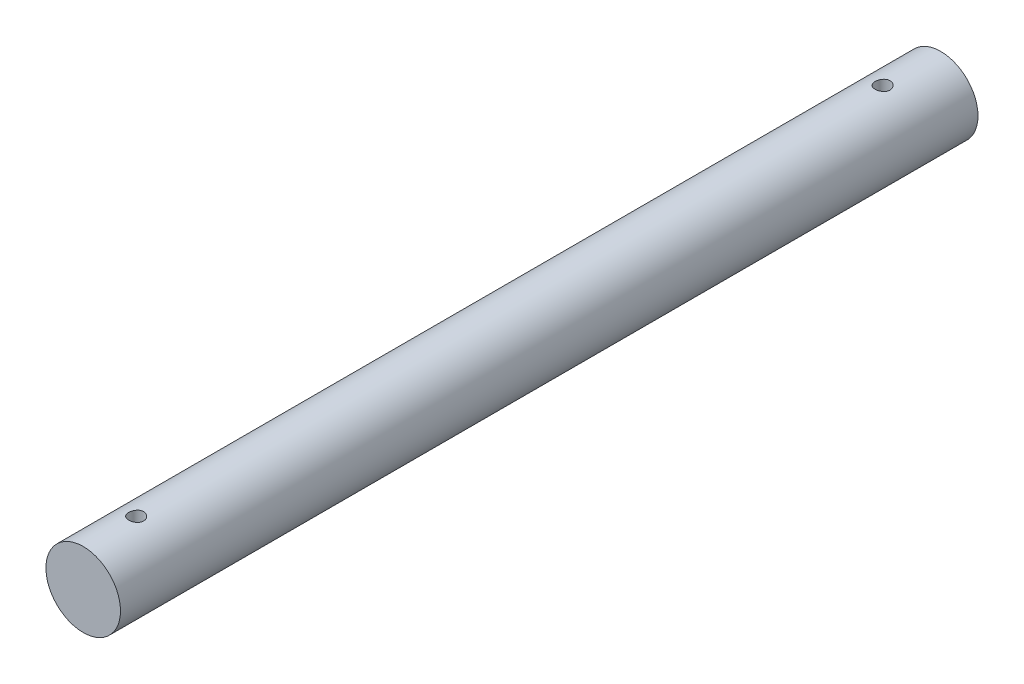
ISO-10303-21;
HEADER;
FILE_DESCRIPTION(('STEP AP214'),'2;1');
FILE_NAME('part.step','',(''),(''),'','','');
FILE_SCHEMA(('AUTOMOTIVE_DESIGN { 1 0 10303 214 1 1 1 1 }'));
ENDSEC;
DATA;
#1=APPLICATION_CONTEXT('core data for automotive mechanical design processes');
#2=APPLICATION_PROTOCOL_DEFINITION('international standard','automotive_design',2000,#1);
#3=PRODUCT_CONTEXT('',#1,'mechanical');
#4=PRODUCT('Part','Part','',(#3));
#5=PRODUCT_RELATED_PRODUCT_CATEGORY('part','',(#4));
#6=PRODUCT_DEFINITION_FORMATION('','',#4);
#7=PRODUCT_DEFINITION_CONTEXT('part definition',#1,'design');
#8=PRODUCT_DEFINITION('design','',#6,#7);
#9=PRODUCT_DEFINITION_SHAPE('','',#8);
#10=(LENGTH_UNIT() NAMED_UNIT(*) SI_UNIT(.MILLI.,.METRE.));
#11=(NAMED_UNIT(*) PLANE_ANGLE_UNIT() SI_UNIT($,.RADIAN.));
#12=(NAMED_UNIT(*) SI_UNIT($,.STERADIAN.) SOLID_ANGLE_UNIT());
#13=UNCERTAINTY_MEASURE_WITH_UNIT(LENGTH_MEASURE(1.E-05),#10,'distance_accuracy_value','');
#14=(GEOMETRIC_REPRESENTATION_CONTEXT(3) GLOBAL_UNCERTAINTY_ASSIGNED_CONTEXT((#13)) GLOBAL_UNIT_ASSIGNED_CONTEXT((#10,
#11,#12)) REPRESENTATION_CONTEXT('',''));
#15=CARTESIAN_POINT('',(0.,0.,0.));
#16=DIRECTION('',(0.,0.,1.));
#17=DIRECTION('',(1.,0.,0.));
#18=AXIS2_PLACEMENT_3D('',#15,#16,#17);
#19=CARTESIAN_POINT('',(0.,0.,115.));
#20=DIRECTION('',(0.,0.,-1.));
#21=DIRECTION('',(-1.,0.,0.));
#22=AXIS2_PLACEMENT_3D('',#19,#20,#21);
#23=CYLINDRICAL_SURFACE('',#22,5.);
#24=CARTESIAN_POINT('',(0.,-5.,108.89846597582));
#25=CARTESIAN_POINT('',(0.0555769067926326,-4.99999897580871,108.898463931322));
#26=CARTESIAN_POINT('',(0.111179660201522,-4.99906385178231,108.893817132852));
#27=CARTESIAN_POINT('',(0.220813507689018,-4.99542365623231,108.875367475705));
#28=CARTESIAN_POINT('',(0.274843317541354,-4.99271717860186,108.861557343019));
#29=CARTESIAN_POINT('',(0.379730305263311,-4.98583649278287,108.825224702199));
#30=CARTESIAN_POINT('',(0.430590467933133,-4.98166369076718,108.802710538975));
#31=CARTESIAN_POINT('',(0.527807988864224,-4.97230398035314,108.749633728309));
#32=CARTESIAN_POINT('',(0.574165615075809,-4.96711713235707,108.719071560213));
#33=CARTESIAN_POINT('',(0.661693477314864,-4.9562216532997,108.650327481529));
#34=CARTESIAN_POINT('',(0.702793951158526,-4.95050745504347,108.612057620429));
#35=CARTESIAN_POINT('',(0.778036756608032,-4.93924180452588,108.529173559428));
#36=CARTESIAN_POINT('',(0.812178544770427,-4.93369036500424,108.484558864485));
#37=CARTESIAN_POINT('',(0.872831753347623,-4.92332441812615,108.389749782808));
#38=CARTESIAN_POINT('',(0.899270938865871,-4.91851707364946,108.339508332024));
#39=CARTESIAN_POINT('',(0.943305666580311,-4.91026268058418,108.235184156816));
#40=CARTESIAN_POINT('',(0.960902082437239,-4.90681549761962,108.181101812474));
#41=CARTESIAN_POINT('',(0.986525299884828,-4.90172805252204,108.071381611912));
#42=CARTESIAN_POINT('',(0.994674497958778,-4.90006470107188,108.015773431678));
#43=CARTESIAN_POINT('',(1.00155212772612,-4.89866375060627,107.903956154456));
#44=CARTESIAN_POINT('',(1.0002815227135,-4.89892595467841,107.8477471195));
#45=CARTESIAN_POINT('',(0.988454573101822,-4.90132551148185,107.737219187799));
#46=CARTESIAN_POINT('',(0.978038540243909,-4.90343452858763,107.682884570193));
#47=CARTESIAN_POINT('',(0.948437884623055,-4.90924546160001,107.576749899157));
#48=CARTESIAN_POINT('',(0.929252843100686,-4.91294745357779,107.524949966901));
#49=CARTESIAN_POINT('',(0.882524783674724,-4.92155618500408,107.424950714116));
#50=CARTESIAN_POINT('',(0.854926151232117,-4.92647089813704,107.376778096251));
#51=CARTESIAN_POINT('',(0.79219357457268,-4.93694618773062,107.285695125847));
#52=CARTESIAN_POINT('',(0.757058764356829,-4.94250683838366,107.242785378969));
#53=CARTESIAN_POINT('',(0.679499934560583,-4.95377021241462,107.162636573363));
#54=CARTESIAN_POINT('',(0.636956161212443,-4.95947369210905,107.125513407961));
#55=CARTESIAN_POINT('',(0.546185024062007,-4.97028848714408,107.058912129519));
#56=CARTESIAN_POINT('',(0.497957587379386,-4.97539979488974,107.029434114526));
#57=CARTESIAN_POINT('',(0.397059386878918,-4.98446690160887,106.978938466594));
#58=CARTESIAN_POINT('',(0.344381819585298,-4.98842088848272,106.957934082176));
#59=CARTESIAN_POINT('',(0.236148976448666,-4.99471408987858,106.925105501781));
#60=CARTESIAN_POINT('',(0.180594050072454,-4.99705350000531,106.913280193746));
#61=CARTESIAN_POINT('',(0.0691794056271564,-4.99982671866868,106.899309522026));
#62=CARTESIAN_POINT('',(0.0133403283255813,-5.0002917465247,106.89700555628));
#63=CARTESIAN_POINT('',(-0.0979249341927106,-4.99935051930103,106.901715834762));
#64=CARTESIAN_POINT('',(-0.153351142443791,-4.99794436941446,106.908729555173));
#65=CARTESIAN_POINT('',(-0.261705659946538,-4.99343832008018,106.931744349364));
#66=CARTESIAN_POINT('',(-0.314651948339898,-4.99035376404207,106.947664044318));
#67=CARTESIAN_POINT('',(-0.417123627499664,-4.98283552061033,106.987949958476));
#68=CARTESIAN_POINT('',(-0.46664876163754,-4.97840173214227,107.012316810497));
#69=CARTESIAN_POINT('',(-0.561541173686219,-4.96859911533294,107.069148466471));
#70=CARTESIAN_POINT('',(-0.606850126752187,-4.96321950437052,107.101708756859));
#71=CARTESIAN_POINT('',(-0.691418019119207,-4.95214734829882,107.173875167027));
#72=CARTESIAN_POINT('',(-0.730676308930766,-4.94645476968388,107.21348204222));
#73=CARTESIAN_POINT('',(-0.802640590774179,-4.93529303556965,107.299339327711));
#74=CARTESIAN_POINT('',(-0.835237702448654,-4.92982860233304,107.345681720041));
#75=CARTESIAN_POINT('',(-0.8921854200512,-4.91984191796194,107.443277337177));
#76=CARTESIAN_POINT('',(-0.916536355922898,-4.91531962913343,107.494530365394));
#77=CARTESIAN_POINT('',(-0.956151841581959,-4.90776740584383,107.60023422197));
#78=CARTESIAN_POINT('',(-0.971463499791051,-4.90472974872187,107.65466681703));
#79=CARTESIAN_POINT('',(-0.992708651627196,-4.90047436792025,107.765399429311));
#80=CARTESIAN_POINT('',(-0.998643368225112,-4.89925640691111,107.821699202029));
#81=CARTESIAN_POINT('',(-1.00092091086747,-4.89879149631379,107.933474840364));
#82=CARTESIAN_POINT('',(-0.997435788070897,-4.89950919189301,107.988947124747));
#83=CARTESIAN_POINT('',(-0.981352304100062,-4.90275573484614,108.098497625725));
#84=CARTESIAN_POINT('',(-0.968754016129299,-4.90528456767169,108.152575853515));
#85=CARTESIAN_POINT('',(-0.934878568498953,-4.91185264219159,108.257693687061));
#86=CARTESIAN_POINT('',(-0.913622506717342,-4.91588821018831,108.308740336322));
#87=CARTESIAN_POINT('',(-0.863054644601603,-4.9250171497417,108.406569696554));
#88=CARTESIAN_POINT('',(-0.833742168774884,-4.93011060998894,108.453352049545));
#89=CARTESIAN_POINT('',(-0.767305914786415,-4.94088960523225,108.54218154797));
#90=CARTESIAN_POINT('',(-0.730057887235178,-4.946583729097,108.584134741088));
#91=CARTESIAN_POINT('',(-0.649064369013136,-4.95786081871955,108.661252181349));
#92=CARTESIAN_POINT('',(-0.605317387153333,-4.96344375863185,108.696414866137));
#93=CARTESIAN_POINT('',(-0.512017629088246,-4.97393832387971,108.759300619766));
#94=CARTESIAN_POINT('',(-0.462408884429834,-4.97884231219246,108.7869419791));
#95=CARTESIAN_POINT('',(-0.359166360940734,-4.98735125085,108.833452098417));
#96=CARTESIAN_POINT('',(-0.30553626086313,-4.99095737138616,108.852328765353));
#97=CARTESIAN_POINT('',(-0.209821488923785,-4.99576372595371,108.877117923865));
#98=CARTESIAN_POINT('',(-0.168281664013789,-4.99734303158452,108.885109169528));
#99=CARTESIAN_POINT('',(-0.0844995252100698,-4.99946154139893,108.895783888178));
#100=CARTESIAN_POINT('',(-0.0422572337486206,-5.00000077873155,108.89846753033));
#101=CARTESIAN_POINT('',(0.,-5.,108.89846597582));
#102=B_SPLINE_CURVE_WITH_KNOTS('',3,(#24,#25,#26,#27,#28,#29,#30,#31,#32,#33,#34,#35,#36,#37,
#38,#39,#40,#41,#42,#43,#44,#45,#46,#47,#48,#49,#50,#51,#52,#53,#54,#55,#56,#57,#58,#59,#60,#61,
#62,#63,#64,#65,#66,#67,#68,#69,#70,#71,#72,#73,#74,#75,#76,#77,#78,#79,#80,#81,#82,#83,#84,#85,
#86,#87,#88,#89,#90,#91,#92,#93,#94,#95,#96,#97,#98,#99,#100,#101),.UNSPECIFIED.,.T.,.F.,(4,2,2,
2,2,2,2,2,2,2,2,2,2,2,2,2,2,2,2,2,2,2,2,2,2,2,2,2,2,2,2,2,2,2,2,2,2,2,4),(0.,0.166576130661257,
0.333284650691323,0.499833735250339,0.666372902230865,0.834932670112192,1.00350559674737,
1.17361195005923,1.34370149365198,1.51156185103589,1.67940504281224,1.84471727006278,
2.01003739253729,2.17647490203591,2.34293154749671,2.51238252491352,2.68183567539821,
2.85155274854024,3.02124925698035,3.18810735676265,3.35495607657867,3.52030453950723,
3.68566539216022,3.85305066033359,4.0204538834593,4.19040628579226,4.36035188723465,
4.52940381032723,4.69843368330414,4.86439722567702,5.03035943492609,5.1959196125311,
5.36149367581867,5.52988076239145,5.69830654532931,5.86849496675638,6.03852955517518,
6.16518775289894,6.29184191370997),.UNSPECIFIED.);
#103=CARTESIAN_POINT('',(0.,-5.,108.89846597582));
#104=VERTEX_POINT('',#103);
#105=EDGE_CURVE('E34',#104,#104,#102,.T.);
#106=ORIENTED_EDGE('',*,*,#105,.T.);
#107=EDGE_LOOP('',(#106));
#108=FACE_BOUND('',#107,.T.);
#109=CARTESIAN_POINT('',(0.,5.,108.89846597582));
#110=CARTESIAN_POINT('',(-0.0555769067926326,4.99999897580871,108.898463931322));
#111=CARTESIAN_POINT('',(-0.111179660201522,4.99906385178231,108.893817132852));
#112=CARTESIAN_POINT('',(-0.220813507689018,4.99542365623231,108.875367475705));
#113=CARTESIAN_POINT('',(-0.274843317541354,4.99271717860186,108.861557343019));
#114=CARTESIAN_POINT('',(-0.379730305263311,4.98583649278287,108.825224702199));
#115=CARTESIAN_POINT('',(-0.430590467933133,4.98166369076718,108.802710538975));
#116=CARTESIAN_POINT('',(-0.527807988864224,4.97230398035314,108.749633728309));
#117=CARTESIAN_POINT('',(-0.574165615075809,4.96711713235707,108.719071560213));
#118=CARTESIAN_POINT('',(-0.661693477314864,4.9562216532997,108.650327481529));
#119=CARTESIAN_POINT('',(-0.702793951158526,4.95050745504347,108.612057620429));
#120=CARTESIAN_POINT('',(-0.778036756608032,4.93924180452588,108.529173559428));
#121=CARTESIAN_POINT('',(-0.812178544770427,4.93369036500424,108.484558864485));
#122=CARTESIAN_POINT('',(-0.872831753347623,4.92332441812615,108.389749782808));
#123=CARTESIAN_POINT('',(-0.899270938865871,4.91851707364946,108.339508332024));
#124=CARTESIAN_POINT('',(-0.943305666580311,4.91026268058418,108.235184156816));
#125=CARTESIAN_POINT('',(-0.960902082437239,4.90681549761962,108.181101812474));
#126=CARTESIAN_POINT('',(-0.986525299884828,4.90172805252204,108.071381611912));
#127=CARTESIAN_POINT('',(-0.994674497958778,4.90006470107188,108.015773431678));
#128=CARTESIAN_POINT('',(-1.00155212772612,4.89866375060627,107.903956154456));
#129=CARTESIAN_POINT('',(-1.0002815227135,4.89892595467841,107.8477471195));
#130=CARTESIAN_POINT('',(-0.988454573101822,4.90132551148185,107.737219187799));
#131=CARTESIAN_POINT('',(-0.978038540243909,4.90343452858763,107.682884570193));
#132=CARTESIAN_POINT('',(-0.948437884623055,4.90924546160001,107.576749899157));
#133=CARTESIAN_POINT('',(-0.929252843100686,4.91294745357779,107.524949966901));
#134=CARTESIAN_POINT('',(-0.882524783674724,4.92155618500408,107.424950714116));
#135=CARTESIAN_POINT('',(-0.854926151232117,4.92647089813704,107.376778096251));
#136=CARTESIAN_POINT('',(-0.79219357457268,4.93694618773062,107.285695125847));
#137=CARTESIAN_POINT('',(-0.757058764356829,4.94250683838366,107.242785378969));
#138=CARTESIAN_POINT('',(-0.679499934560583,4.95377021241462,107.162636573363));
#139=CARTESIAN_POINT('',(-0.636956161212443,4.95947369210905,107.125513407961));
#140=CARTESIAN_POINT('',(-0.546185024062007,4.97028848714408,107.058912129519));
#141=CARTESIAN_POINT('',(-0.497957587379386,4.97539979488974,107.029434114526));
#142=CARTESIAN_POINT('',(-0.397059386878918,4.98446690160887,106.978938466594));
#143=CARTESIAN_POINT('',(-0.344381819585298,4.98842088848272,106.957934082176));
#144=CARTESIAN_POINT('',(-0.236148976448666,4.99471408987858,106.925105501781));
#145=CARTESIAN_POINT('',(-0.180594050072454,4.99705350000531,106.913280193746));
#146=CARTESIAN_POINT('',(-0.0691794056271564,4.99982671866868,106.899309522026));
#147=CARTESIAN_POINT('',(-0.0133403283255813,5.0002917465247,106.89700555628));
#148=CARTESIAN_POINT('',(0.0979249341927106,4.99935051930103,106.901715834762));
#149=CARTESIAN_POINT('',(0.153351142443791,4.99794436941446,106.908729555173));
#150=CARTESIAN_POINT('',(0.261705659946538,4.99343832008018,106.931744349364));
#151=CARTESIAN_POINT('',(0.314651948339898,4.99035376404207,106.947664044318));
#152=CARTESIAN_POINT('',(0.417123627499664,4.98283552061033,106.987949958476));
#153=CARTESIAN_POINT('',(0.46664876163754,4.97840173214227,107.012316810497));
#154=CARTESIAN_POINT('',(0.561541173686219,4.96859911533294,107.069148466471));
#155=CARTESIAN_POINT('',(0.606850126752187,4.96321950437052,107.101708756859));
#156=CARTESIAN_POINT('',(0.691418019119207,4.95214734829882,107.173875167027));
#157=CARTESIAN_POINT('',(0.730676308930766,4.94645476968388,107.21348204222));
#158=CARTESIAN_POINT('',(0.802640590774179,4.93529303556965,107.299339327711));
#159=CARTESIAN_POINT('',(0.835237702448654,4.92982860233304,107.345681720041));
#160=CARTESIAN_POINT('',(0.8921854200512,4.91984191796194,107.443277337177));
#161=CARTESIAN_POINT('',(0.916536355922898,4.91531962913343,107.494530365394));
#162=CARTESIAN_POINT('',(0.956151841581959,4.90776740584383,107.60023422197));
#163=CARTESIAN_POINT('',(0.971463499791051,4.90472974872187,107.65466681703));
#164=CARTESIAN_POINT('',(0.992708651627196,4.90047436792025,107.765399429311));
#165=CARTESIAN_POINT('',(0.998643368225112,4.89925640691111,107.821699202029));
#166=CARTESIAN_POINT('',(1.00092091086747,4.89879149631379,107.933474840364));
#167=CARTESIAN_POINT('',(0.997435788070897,4.89950919189301,107.988947124747));
#168=CARTESIAN_POINT('',(0.981352304100062,4.90275573484614,108.098497625725));
#169=CARTESIAN_POINT('',(0.968754016129299,4.90528456767169,108.152575853515));
#170=CARTESIAN_POINT('',(0.934878568498953,4.91185264219159,108.257693687061));
#171=CARTESIAN_POINT('',(0.913622506717342,4.91588821018831,108.308740336322));
#172=CARTESIAN_POINT('',(0.863054644601603,4.9250171497417,108.406569696554));
#173=CARTESIAN_POINT('',(0.833742168774884,4.93011060998894,108.453352049545));
#174=CARTESIAN_POINT('',(0.767305914786415,4.94088960523225,108.54218154797));
#175=CARTESIAN_POINT('',(0.730057887235178,4.946583729097,108.584134741088));
#176=CARTESIAN_POINT('',(0.649064369013136,4.95786081871955,108.661252181349));
#177=CARTESIAN_POINT('',(0.605317387153333,4.96344375863185,108.696414866137));
#178=CARTESIAN_POINT('',(0.512017629088246,4.97393832387971,108.759300619766));
#179=CARTESIAN_POINT('',(0.462408884429834,4.97884231219246,108.7869419791));
#180=CARTESIAN_POINT('',(0.359166360940734,4.98735125085,108.833452098417));
#181=CARTESIAN_POINT('',(0.30553626086313,4.99095737138616,108.852328765353));
#182=CARTESIAN_POINT('',(0.209821488923785,4.99576372595371,108.877117923865));
#183=CARTESIAN_POINT('',(0.168281664013789,4.99734303158452,108.885109169528));
#184=CARTESIAN_POINT('',(0.0844995252100698,4.99946154139893,108.895783888178));
#185=CARTESIAN_POINT('',(0.0422572337486206,5.00000077873155,108.89846753033));
#186=CARTESIAN_POINT('',(0.,5.,108.89846597582));
#187=B_SPLINE_CURVE_WITH_KNOTS('',3,(#109,#110,#111,#112,#113,#114,#115,#116,#117,#118,#119,
#120,#121,#122,#123,#124,#125,#126,#127,#128,#129,#130,#131,#132,#133,#134,#135,#136,#137,#138,
#139,#140,#141,#142,#143,#144,#145,#146,#147,#148,#149,#150,#151,#152,#153,#154,#155,#156,#157,
#158,#159,#160,#161,#162,#163,#164,#165,#166,#167,#168,#169,#170,#171,#172,#173,#174,#175,#176,
#177,#178,#179,#180,#181,#182,#183,#184,#185,#186),.UNSPECIFIED.,.T.,.F.,(4,2,2,2,2,2,2,2,2,2,2,
2,2,2,2,2,2,2,2,2,2,2,2,2,2,2,2,2,2,2,2,2,2,2,2,2,2,2,4),(0.,0.166576130661257,
0.333284650691323,0.499833735250339,0.666372902230865,0.834932670112192,1.00350559674737,
1.17361195005923,1.34370149365198,1.51156185103589,1.67940504281224,1.84471727006278,
2.01003739253729,2.17647490203591,2.34293154749671,2.51238252491352,2.68183567539821,
2.85155274854024,3.02124925698035,3.18810735676265,3.35495607657867,3.52030453950723,
3.68566539216022,3.85305066033359,4.0204538834593,4.19040628579226,4.36035188723465,
4.52940381032723,4.69843368330414,4.86439722567702,5.03035943492609,5.1959196125311,
5.36149367581867,5.52988076239145,5.69830654532931,5.86849496675638,6.03852955517518,
6.16518775289894,6.29184191370997),.UNSPECIFIED.);
#188=CARTESIAN_POINT('',(0.,5.,108.89846597582));
#189=VERTEX_POINT('',#188);
#190=EDGE_CURVE('E83',#189,#189,#187,.T.);
#191=ORIENTED_EDGE('',*,*,#190,.T.);
#192=EDGE_LOOP('',(#191));
#193=FACE_BOUND('',#192,.T.);
#194=CARTESIAN_POINT('',(0.,-5.,8.801268192392));
#195=CARTESIAN_POINT('',(0.0555769067926332,-4.99999897580871,8.80126614789366));
#196=CARTESIAN_POINT('',(0.111179660201522,-4.99906385178231,8.79661934942436));
#197=CARTESIAN_POINT('',(0.220813507689019,-4.99542365623231,8.77816969227676));
#198=CARTESIAN_POINT('',(0.274843317541356,-4.99271717860186,8.7643595595905));
#199=CARTESIAN_POINT('',(0.379730305263313,-4.98583649278287,8.72802691877122));
#200=CARTESIAN_POINT('',(0.430590467933134,-4.98166369076718,8.70551275554732));
#201=CARTESIAN_POINT('',(0.527807988864225,-4.97230398035314,8.65243594488071));
#202=CARTESIAN_POINT('',(0.574165615075812,-4.96711713235707,8.6218737767848));
#203=CARTESIAN_POINT('',(0.661693477314865,-4.9562216532997,8.55312969810057));
#204=CARTESIAN_POINT('',(0.702793951158524,-4.95050745504347,8.5148598370008));
#205=CARTESIAN_POINT('',(0.778036756608028,-4.93924180452588,8.4319757760003));
#206=CARTESIAN_POINT('',(0.812178544770424,-4.93369036500424,8.38736108105689));
#207=CARTESIAN_POINT('',(0.87283175334762,-4.92332441812615,8.29255199938013));
#208=CARTESIAN_POINT('',(0.899270938865866,-4.91851707364946,8.24231054859565));
#209=CARTESIAN_POINT('',(0.943305666580308,-4.91026268058418,8.13798637338793));
#210=CARTESIAN_POINT('',(0.960902082437238,-4.90681549761962,8.08390402904566));
#211=CARTESIAN_POINT('',(0.986525299884827,-4.90172805252204,7.97418382848409));
#212=CARTESIAN_POINT('',(0.994674497958777,-4.90006470107188,7.91857564824978));
#213=CARTESIAN_POINT('',(1.00155212772612,-4.89866375060627,7.80675837102766));
#214=CARTESIAN_POINT('',(1.0002815227135,-4.89892595467841,7.75054933607186));
#215=CARTESIAN_POINT('',(0.988454573101819,-4.90132551148185,7.640021404371));
#216=CARTESIAN_POINT('',(0.978038540243905,-4.90343452858763,7.58568678676469));
#217=CARTESIAN_POINT('',(0.94843788462305,-4.90924546160001,7.479552115729));
#218=CARTESIAN_POINT('',(0.929252843100681,-4.91294745357779,7.427752183473));
#219=CARTESIAN_POINT('',(0.88252478367472,-4.92155618500408,7.32775293068841));
#220=CARTESIAN_POINT('',(0.854926151232114,-4.92647089813704,7.27958031282283));
#221=CARTESIAN_POINT('',(0.792193574572679,-4.93694618773062,7.18849734241919));
#222=CARTESIAN_POINT('',(0.757058764356829,-4.94250683838366,7.14558759554085));
#223=CARTESIAN_POINT('',(0.679499934560584,-4.95377021241462,7.06543878993507));
#224=CARTESIAN_POINT('',(0.636956161212445,-4.95947369210905,7.02831562453287));
#225=CARTESIAN_POINT('',(0.54618502406201,-4.97028848714408,6.96171434609078));
#226=CARTESIAN_POINT('',(0.497957587379389,-4.97539979488974,6.93223633109843));
#227=CARTESIAN_POINT('',(0.397059386878921,-4.98446690160887,6.88174068316603));
#228=CARTESIAN_POINT('',(0.3443818195853,-4.98842088848272,6.86073629874747));
#229=CARTESIAN_POINT('',(0.236148976448665,-4.99471408987858,6.82790771835344));
#230=CARTESIAN_POINT('',(0.180594050072449,-4.99705350000531,6.81608241031838));
#231=CARTESIAN_POINT('',(0.0691794056271504,-4.99982671866868,6.80211173859773));
#232=CARTESIAN_POINT('',(0.0133403283255761,-5.0002917465247,6.79980777285174));
#233=CARTESIAN_POINT('',(-0.0979249341927141,-4.99935051930103,6.80451805133418));
#234=CARTESIAN_POINT('',(-0.153351142443793,-4.99794436941446,6.8115317717446));
#235=CARTESIAN_POINT('',(-0.261705659946541,-4.99343832008018,6.83454656593596));
#236=CARTESIAN_POINT('',(-0.314651948339903,-4.99035376404206,6.85046626088991));
#237=CARTESIAN_POINT('',(-0.417123627499667,-4.98283552061033,6.89075217504781));
#238=CARTESIAN_POINT('',(-0.46664876163754,-4.97840173214227,6.91511902706883));
#239=CARTESIAN_POINT('',(-0.561541173686218,-4.96859911533294,6.97195068304332));
#240=CARTESIAN_POINT('',(-0.606850126752188,-4.96321950437052,7.00451097343095));
#241=CARTESIAN_POINT('',(-0.691418019119207,-4.95214734829882,7.07667738359928));
#242=CARTESIAN_POINT('',(-0.730676308930763,-4.94645476968388,7.11628425879187));
#243=CARTESIAN_POINT('',(-0.802640590774176,-4.93529303556965,7.20214154428313));
#244=CARTESIAN_POINT('',(-0.835237702448655,-4.92982860233304,7.24848393661334));
#245=CARTESIAN_POINT('',(-0.892185420051206,-4.91984191796194,7.34607955374868));
#246=CARTESIAN_POINT('',(-0.916536355922903,-4.91531962913342,7.39733258196556));
#247=CARTESIAN_POINT('',(-0.95615184158196,-4.90776740584383,7.50303643854155));
#248=CARTESIAN_POINT('',(-0.971463499791051,-4.90472974872187,7.55746903360232));
#249=CARTESIAN_POINT('',(-0.992708651627196,-4.90047436792025,7.66820164588291));
#250=CARTESIAN_POINT('',(-0.998643368225112,-4.89925640691111,7.72450141860135));
#251=CARTESIAN_POINT('',(-1.00092091086747,-4.89879149631379,7.83627705693632));
#252=CARTESIAN_POINT('',(-0.997435788070896,-4.89950919189301,7.89174934131901));
#253=CARTESIAN_POINT('',(-0.981352304100061,-4.90275573484614,8.00129984229703));
#254=CARTESIAN_POINT('',(-0.968754016129298,-4.90528456767169,8.05537807008681));
#255=CARTESIAN_POINT('',(-0.934878568498954,-4.91185264219159,8.16049590363255));
#256=CARTESIAN_POINT('',(-0.913622506717344,-4.91588821018831,8.21154255289442));
#257=CARTESIAN_POINT('',(-0.863054644601603,-4.9250171497417,8.30937191312645));
#258=CARTESIAN_POINT('',(-0.833742168774881,-4.93011060998894,8.35615426611714));
#259=CARTESIAN_POINT('',(-0.767305914786413,-4.94088960523225,8.44498376454232));
#260=CARTESIAN_POINT('',(-0.73005788723518,-4.94658372909699,8.4869369576596));
#261=CARTESIAN_POINT('',(-0.649064369013141,-4.95786081871955,8.56405439792118));
#262=CARTESIAN_POINT('',(-0.605317387153334,-4.96344375863184,8.59921708270928));
#263=CARTESIAN_POINT('',(-0.512017629088246,-4.97393832387971,8.66210283633845));
#264=CARTESIAN_POINT('',(-0.462408884429834,-4.97884231219246,8.68974419567203));
#265=CARTESIAN_POINT('',(-0.359166360940731,-4.98735125085,8.73625431498859));
#266=CARTESIAN_POINT('',(-0.305536260863125,-4.99095737138616,8.7551309819245));
#267=CARTESIAN_POINT('',(-0.209821488923778,-4.99576372595371,8.77992014043672));
#268=CARTESIAN_POINT('',(-0.168281664013784,-4.99734303158452,8.78791138609976));
#269=CARTESIAN_POINT('',(-0.0844995252100663,-4.99946154139893,8.79858610475037));
#270=CARTESIAN_POINT('',(-0.0422572337486187,-5.00000077873155,8.80126974690177));
#271=CARTESIAN_POINT('',(0.,-5.,8.801268192392));
#272=B_SPLINE_CURVE_WITH_KNOTS('',3,(#194,#195,#196,#197,#198,#199,#200,#201,#202,#203,#204,
#205,#206,#207,#208,#209,#210,#211,#212,#213,#214,#215,#216,#217,#218,#219,#220,#221,#222,#223,
#224,#225,#226,#227,#228,#229,#230,#231,#232,#233,#234,#235,#236,#237,#238,#239,#240,#241,#242,
#243,#244,#245,#246,#247,#248,#249,#250,#251,#252,#253,#254,#255,#256,#257,#258,#259,#260,#261,
#262,#263,#264,#265,#266,#267,#268,#269,#270,#271),.UNSPECIFIED.,.T.,.F.,(4,2,2,2,2,2,2,2,2,2,2,
2,2,2,2,2,2,2,2,2,2,2,2,2,2,2,2,2,2,2,2,2,2,2,2,2,2,2,4),(0.,0.166576130661258,
0.333284650691323,0.499833735250342,0.666372902230863,0.834932670112185,1.00350559674736,
1.17361195005922,1.34370149365197,1.51156185103587,1.67940504281225,1.84471727006278,
2.0100373925373,2.17647490203593,2.3429315474967,2.51238252491351,2.6818356753982,
2.85155274854024,3.02124925698036,3.18810735676265,3.35495607657868,3.52030453950723,
3.68566539216022,3.85305066033359,4.0204538834593,4.19040628579226,4.36035188723466,
4.52940381032723,4.69843368330415,4.86439722567701,5.03035943492608,5.1959196125311,
5.36149367581867,5.52988076239143,5.69830654532931,5.86849496675637,6.03852955517519,
6.16518775289894,6.29184191370996),.UNSPECIFIED.);
#273=CARTESIAN_POINT('',(0.,-5.,8.801268192392));
#274=VERTEX_POINT('',#273);
#275=EDGE_CURVE('E46',#274,#274,#272,.T.);
#276=ORIENTED_EDGE('',*,*,#275,.T.);
#277=EDGE_LOOP('',(#276));
#278=FACE_BOUND('',#277,.T.);
#279=CARTESIAN_POINT('',(0.,5.,8.801268192392));
#280=CARTESIAN_POINT('',(-0.0555769067926332,4.99999897580871,8.80126614789366));
#281=CARTESIAN_POINT('',(-0.111179660201522,4.99906385178231,8.79661934942436));
#282=CARTESIAN_POINT('',(-0.220813507689019,4.99542365623231,8.77816969227676));
#283=CARTESIAN_POINT('',(-0.274843317541356,4.99271717860186,8.7643595595905));
#284=CARTESIAN_POINT('',(-0.379730305263313,4.98583649278287,8.72802691877122));
#285=CARTESIAN_POINT('',(-0.430590467933134,4.98166369076718,8.70551275554732));
#286=CARTESIAN_POINT('',(-0.527807988864225,4.97230398035314,8.65243594488071));
#287=CARTESIAN_POINT('',(-0.574165615075812,4.96711713235707,8.6218737767848));
#288=CARTESIAN_POINT('',(-0.661693477314865,4.9562216532997,8.55312969810057));
#289=CARTESIAN_POINT('',(-0.702793951158524,4.95050745504347,8.5148598370008));
#290=CARTESIAN_POINT('',(-0.778036756608028,4.93924180452588,8.4319757760003));
#291=CARTESIAN_POINT('',(-0.812178544770424,4.93369036500424,8.38736108105689));
#292=CARTESIAN_POINT('',(-0.87283175334762,4.92332441812615,8.29255199938013));
#293=CARTESIAN_POINT('',(-0.899270938865866,4.91851707364946,8.24231054859565));
#294=CARTESIAN_POINT('',(-0.943305666580308,4.91026268058418,8.13798637338793));
#295=CARTESIAN_POINT('',(-0.960902082437238,4.90681549761962,8.08390402904566));
#296=CARTESIAN_POINT('',(-0.986525299884827,4.90172805252204,7.97418382848409));
#297=CARTESIAN_POINT('',(-0.994674497958777,4.90006470107188,7.91857564824978));
#298=CARTESIAN_POINT('',(-1.00155212772612,4.89866375060627,7.80675837102766));
#299=CARTESIAN_POINT('',(-1.0002815227135,4.89892595467841,7.75054933607186));
#300=CARTESIAN_POINT('',(-0.988454573101819,4.90132551148185,7.640021404371));
#301=CARTESIAN_POINT('',(-0.978038540243905,4.90343452858763,7.58568678676469));
#302=CARTESIAN_POINT('',(-0.94843788462305,4.90924546160001,7.479552115729));
#303=CARTESIAN_POINT('',(-0.929252843100681,4.91294745357779,7.427752183473));
#304=CARTESIAN_POINT('',(-0.88252478367472,4.92155618500408,7.32775293068841));
#305=CARTESIAN_POINT('',(-0.854926151232114,4.92647089813704,7.27958031282283));
#306=CARTESIAN_POINT('',(-0.792193574572679,4.93694618773062,7.18849734241919));
#307=CARTESIAN_POINT('',(-0.757058764356829,4.94250683838366,7.14558759554085));
#308=CARTESIAN_POINT('',(-0.679499934560584,4.95377021241462,7.06543878993507));
#309=CARTESIAN_POINT('',(-0.636956161212445,4.95947369210905,7.02831562453287));
#310=CARTESIAN_POINT('',(-0.54618502406201,4.97028848714408,6.96171434609078));
#311=CARTESIAN_POINT('',(-0.497957587379389,4.97539979488974,6.93223633109843));
#312=CARTESIAN_POINT('',(-0.397059386878921,4.98446690160887,6.88174068316603));
#313=CARTESIAN_POINT('',(-0.3443818195853,4.98842088848272,6.86073629874747));
#314=CARTESIAN_POINT('',(-0.236148976448665,4.99471408987858,6.82790771835344));
#315=CARTESIAN_POINT('',(-0.180594050072449,4.99705350000531,6.81608241031838));
#316=CARTESIAN_POINT('',(-0.0691794056271504,4.99982671866868,6.80211173859773));
#317=CARTESIAN_POINT('',(-0.0133403283255761,5.0002917465247,6.79980777285174));
#318=CARTESIAN_POINT('',(0.0979249341927141,4.99935051930103,6.80451805133418));
#319=CARTESIAN_POINT('',(0.153351142443793,4.99794436941446,6.8115317717446));
#320=CARTESIAN_POINT('',(0.261705659946541,4.99343832008018,6.83454656593596));
#321=CARTESIAN_POINT('',(0.314651948339903,4.99035376404206,6.85046626088991));
#322=CARTESIAN_POINT('',(0.417123627499667,4.98283552061033,6.89075217504781));
#323=CARTESIAN_POINT('',(0.46664876163754,4.97840173214227,6.91511902706883));
#324=CARTESIAN_POINT('',(0.561541173686218,4.96859911533294,6.97195068304332));
#325=CARTESIAN_POINT('',(0.606850126752188,4.96321950437052,7.00451097343095));
#326=CARTESIAN_POINT('',(0.691418019119207,4.95214734829882,7.07667738359928));
#327=CARTESIAN_POINT('',(0.730676308930763,4.94645476968388,7.11628425879187));
#328=CARTESIAN_POINT('',(0.802640590774176,4.93529303556965,7.20214154428313));
#329=CARTESIAN_POINT('',(0.835237702448655,4.92982860233304,7.24848393661334));
#330=CARTESIAN_POINT('',(0.892185420051206,4.91984191796194,7.34607955374868));
#331=CARTESIAN_POINT('',(0.916536355922903,4.91531962913342,7.39733258196556));
#332=CARTESIAN_POINT('',(0.95615184158196,4.90776740584383,7.50303643854155));
#333=CARTESIAN_POINT('',(0.971463499791051,4.90472974872187,7.55746903360232));
#334=CARTESIAN_POINT('',(0.992708651627196,4.90047436792025,7.66820164588291));
#335=CARTESIAN_POINT('',(0.998643368225112,4.89925640691111,7.72450141860135));
#336=CARTESIAN_POINT('',(1.00092091086747,4.89879149631379,7.83627705693632));
#337=CARTESIAN_POINT('',(0.997435788070896,4.89950919189301,7.89174934131901));
#338=CARTESIAN_POINT('',(0.981352304100061,4.90275573484614,8.00129984229703));
#339=CARTESIAN_POINT('',(0.968754016129298,4.90528456767169,8.05537807008681));
#340=CARTESIAN_POINT('',(0.934878568498954,4.91185264219159,8.16049590363255));
#341=CARTESIAN_POINT('',(0.913622506717344,4.91588821018831,8.21154255289442));
#342=CARTESIAN_POINT('',(0.863054644601603,4.9250171497417,8.30937191312645));
#343=CARTESIAN_POINT('',(0.833742168774881,4.93011060998894,8.35615426611714));
#344=CARTESIAN_POINT('',(0.767305914786413,4.94088960523225,8.44498376454232));
#345=CARTESIAN_POINT('',(0.73005788723518,4.94658372909699,8.4869369576596));
#346=CARTESIAN_POINT('',(0.649064369013141,4.95786081871955,8.56405439792118));
#347=CARTESIAN_POINT('',(0.605317387153334,4.96344375863184,8.59921708270928));
#348=CARTESIAN_POINT('',(0.512017629088246,4.97393832387971,8.66210283633845));
#349=CARTESIAN_POINT('',(0.462408884429834,4.97884231219246,8.68974419567203));
#350=CARTESIAN_POINT('',(0.359166360940731,4.98735125085,8.73625431498859));
#351=CARTESIAN_POINT('',(0.305536260863125,4.99095737138616,8.7551309819245));
#352=CARTESIAN_POINT('',(0.209821488923778,4.99576372595371,8.77992014043672));
#353=CARTESIAN_POINT('',(0.168281664013784,4.99734303158452,8.78791138609976));
#354=CARTESIAN_POINT('',(0.0844995252100663,4.99946154139893,8.79858610475037));
#355=CARTESIAN_POINT('',(0.0422572337486187,5.00000077873155,8.80126974690177));
#356=CARTESIAN_POINT('',(0.,5.,8.801268192392));
#357=B_SPLINE_CURVE_WITH_KNOTS('',3,(#279,#280,#281,#282,#283,#284,#285,#286,#287,#288,#289,
#290,#291,#292,#293,#294,#295,#296,#297,#298,#299,#300,#301,#302,#303,#304,#305,#306,#307,#308,
#309,#310,#311,#312,#313,#314,#315,#316,#317,#318,#319,#320,#321,#322,#323,#324,#325,#326,#327,
#328,#329,#330,#331,#332,#333,#334,#335,#336,#337,#338,#339,#340,#341,#342,#343,#344,#345,#346,
#347,#348,#349,#350,#351,#352,#353,#354,#355,#356),.UNSPECIFIED.,.T.,.F.,(4,2,2,2,2,2,2,2,2,2,2,
2,2,2,2,2,2,2,2,2,2,2,2,2,2,2,2,2,2,2,2,2,2,2,2,2,2,2,4),(0.,0.166576130661258,
0.333284650691323,0.499833735250342,0.666372902230863,0.834932670112185,1.00350559674736,
1.17361195005922,1.34370149365197,1.51156185103587,1.67940504281225,1.84471727006278,
2.0100373925373,2.17647490203593,2.3429315474967,2.51238252491351,2.6818356753982,
2.85155274854024,3.02124925698036,3.18810735676265,3.35495607657868,3.52030453950723,
3.68566539216022,3.85305066033359,4.0204538834593,4.19040628579226,4.36035188723466,
4.52940381032723,4.69843368330415,4.86439722567701,5.03035943492608,5.1959196125311,
5.36149367581867,5.52988076239143,5.69830654532931,5.86849496675637,6.03852955517519,
6.16518775289894,6.29184191370996),.UNSPECIFIED.);
#358=CARTESIAN_POINT('',(0.,5.,8.801268192392));
#359=VERTEX_POINT('',#358);
#360=EDGE_CURVE('E49',#359,#359,#357,.T.);
#361=ORIENTED_EDGE('',*,*,#360,.T.);
#362=EDGE_LOOP('',(#361));
#363=FACE_BOUND('',#362,.T.);
#364=CARTESIAN_POINT('',(0.,0.,115.));
#365=DIRECTION('',(0.,0.,1.));
#366=DIRECTION('',(1.,0.,0.));
#367=AXIS2_PLACEMENT_3D('',#364,#365,#366);
#368=CIRCLE('',#367,5.);
#369=CARTESIAN_POINT('',(5.,0.,115.));
#370=VERTEX_POINT('',#369);
#371=EDGE_CURVE('E10',#370,#370,#368,.T.);
#372=ORIENTED_EDGE('',*,*,#371,.F.);
#373=EDGE_LOOP('',(#372));
#374=FACE_BOUND('',#373,.T.);
#375=CARTESIAN_POINT('',(0.,0.,0.));
#376=DIRECTION('',(0.,0.,1.));
#377=DIRECTION('',(1.,0.,0.));
#378=AXIS2_PLACEMENT_3D('',#375,#376,#377);
#379=CIRCLE('',#378,5.);
#380=CARTESIAN_POINT('',(5.,0.,0.));
#381=VERTEX_POINT('',#380);
#382=EDGE_CURVE('E41',#381,#381,#379,.T.);
#383=ORIENTED_EDGE('',*,*,#382,.T.);
#384=EDGE_LOOP('',(#383));
#385=FACE_BOUND('',#384,.T.);
#386=ADVANCED_FACE('F30',(#108,#193,#278,#363,#374,#385),#23,.T.);
#387=CARTESIAN_POINT('',(0.,0.,115.));
#388=DIRECTION('',(0.,0.,1.));
#389=DIRECTION('',(1.,0.,0.));
#390=AXIS2_PLACEMENT_3D('',#387,#388,#389);
#391=PLANE('',#390);
#392=ORIENTED_EDGE('',*,*,#371,.T.);
#393=EDGE_LOOP('',(#392));
#394=FACE_BOUND('',#393,.T.);
#395=ADVANCED_FACE('F65',(#394),#391,.T.);
#396=CARTESIAN_POINT('',(0.,0.,0.));
#397=DIRECTION('',(0.,0.,1.));
#398=DIRECTION('',(1.,0.,0.));
#399=AXIS2_PLACEMENT_3D('',#396,#397,#398);
#400=PLANE('',#399);
#401=ORIENTED_EDGE('',*,*,#382,.F.);
#402=EDGE_LOOP('',(#401));
#403=FACE_BOUND('',#402,.T.);
#404=ADVANCED_FACE('F62',(#403),#400,.F.);
#405=CARTESIAN_POINT('',(0.,-10.,7.801268192392));
#406=DIRECTION('',(0.,1.,0.));
#407=DIRECTION('',(0.,0.,1.));
#408=AXIS2_PLACEMENT_3D('',#405,#406,#407);
#409=CYLINDRICAL_SURFACE('',#408,1.);
#410=ORIENTED_EDGE('',*,*,#360,.F.);
#411=EDGE_LOOP('',(#410));
#412=FACE_BOUND('',#411,.T.);
#413=ORIENTED_EDGE('',*,*,#275,.F.);
#414=EDGE_LOOP('',(#413));
#415=FACE_BOUND('',#414,.T.);
#416=ADVANCED_FACE('F57',(#412,#415),#409,.F.);
#417=CARTESIAN_POINT('',(0.,-10.,107.89846597582));
#418=DIRECTION('',(0.,1.,0.));
#419=DIRECTION('',(0.,0.,1.));
#420=AXIS2_PLACEMENT_3D('',#417,#418,#419);
#421=CYLINDRICAL_SURFACE('',#420,1.);
#422=ORIENTED_EDGE('',*,*,#190,.F.);
#423=EDGE_LOOP('',(#422));
#424=FACE_BOUND('',#423,.T.);
#425=ORIENTED_EDGE('',*,*,#105,.F.);
#426=EDGE_LOOP('',(#425));
#427=FACE_BOUND('',#426,.T.);
#428=ADVANCED_FACE('F61',(#424,#427),#421,.F.);
#429=CLOSED_SHELL('',(#386,#395,#404,#416,#428));
#430=MANIFOLD_SOLID_BREP('B2',#429);
#431=ADVANCED_BREP_SHAPE_REPRESENTATION('',(#18,#430),#14);
#432=SHAPE_DEFINITION_REPRESENTATION(#9,#431);
ENDSEC;
END-ISO-10303-21;
